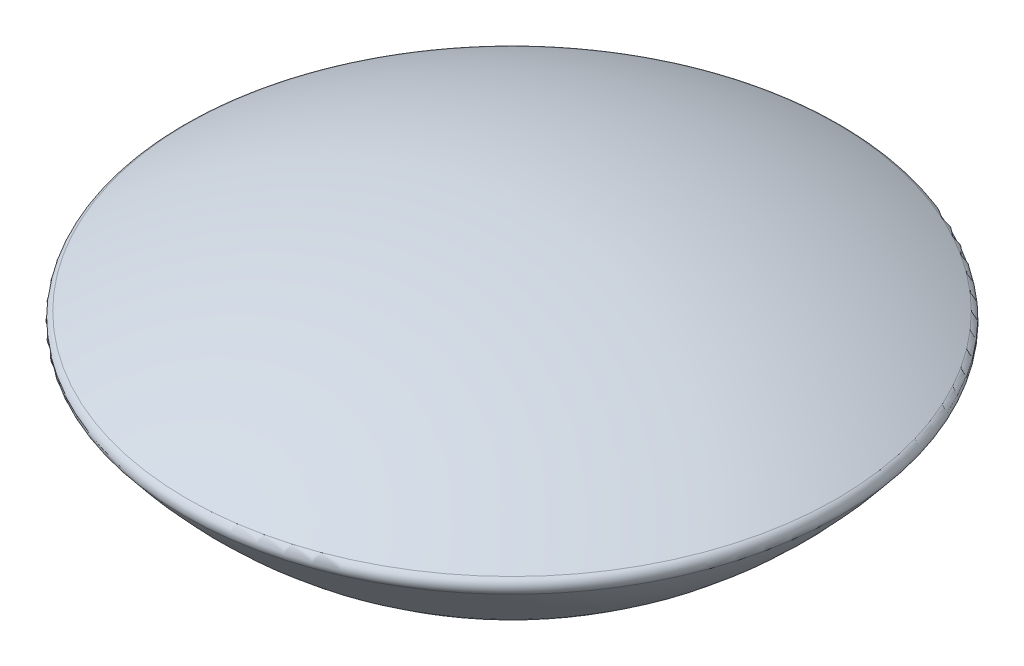
ISO-10303-21;
HEADER;
FILE_DESCRIPTION(('STEP AP214'),'2;1');
FILE_NAME('part.step','',(''),(''),'','','');
FILE_SCHEMA(('AUTOMOTIVE_DESIGN { 1 0 10303 214 1 1 1 1 }'));
ENDSEC;
DATA;
#1=APPLICATION_CONTEXT('core data for automotive mechanical design processes');
#2=APPLICATION_PROTOCOL_DEFINITION('international standard','automotive_design',2000,#1);
#3=PRODUCT_CONTEXT('',#1,'mechanical');
#4=PRODUCT('Part','Part','',(#3));
#5=PRODUCT_RELATED_PRODUCT_CATEGORY('part','',(#4));
#6=PRODUCT_DEFINITION_FORMATION('','',#4);
#7=PRODUCT_DEFINITION_CONTEXT('part definition',#1,'design');
#8=PRODUCT_DEFINITION('design','',#6,#7);
#9=PRODUCT_DEFINITION_SHAPE('','',#8);
#10=(LENGTH_UNIT() NAMED_UNIT(*) SI_UNIT(.MILLI.,.METRE.));
#11=(NAMED_UNIT(*) PLANE_ANGLE_UNIT() SI_UNIT($,.RADIAN.));
#12=(NAMED_UNIT(*) SI_UNIT($,.STERADIAN.) SOLID_ANGLE_UNIT());
#13=UNCERTAINTY_MEASURE_WITH_UNIT(LENGTH_MEASURE(1.E-05),#10,'distance_accuracy_value','');
#14=(GEOMETRIC_REPRESENTATION_CONTEXT(3) GLOBAL_UNCERTAINTY_ASSIGNED_CONTEXT((#13)) GLOBAL_UNIT_ASSIGNED_CONTEXT((#10,
#11,#12)) REPRESENTATION_CONTEXT('',''));
#15=CARTESIAN_POINT('',(0.,0.,0.));
#16=DIRECTION('',(0.,0.,1.));
#17=DIRECTION('',(1.,0.,0.));
#18=AXIS2_PLACEMENT_3D('',#15,#16,#17);
#19=CARTESIAN_POINT('',(0.,6.38,0.));
#20=DIRECTION('',(0.,1.,0.));
#21=DIRECTION('',(1.,0.,0.));
#22=AXIS2_PLACEMENT_3D('',#19,#20,#21);
#23=SPHERICAL_SURFACE('',#22,6.);
#24=CARTESIAN_POINT('',(0.,2.70993314369953,0.));
#25=DIRECTION('',(0.,1.,0.));
#26=DIRECTION('',(0.,0.,1.));
#27=AXIS2_PLACEMENT_3D('',#24,#25,#26);
#28=CIRCLE('',#27,4.74664189404308);
#29=CARTESIAN_POINT('',(0.,2.70993314369953,4.74664189404308));
#30=VERTEX_POINT('',#29);
#31=EDGE_CURVE('E10',#30,#30,#28,.T.);
#32=ORIENTED_EDGE('',*,*,#31,.F.);
#33=EDGE_LOOP('',(#32));
#34=FACE_BOUND('',#33,.T.);
#35=ADVANCED_FACE('F35',(#34),#23,.T.);
#36=CARTESIAN_POINT('',(0.,2.78938488284875,0.));
#37=DIRECTION('',(0.,1.,0.));
#38=DIRECTION('',(0.,0.,1.));
#39=AXIS2_PLACEMENT_3D('',#36,#37,#38);
#40=TOROIDAL_SURFACE('',#39,4.64388383312306,0.129891485240088);
#41=CARTESIAN_POINT('',(0.,2.90400114428793,0.));
#42=DIRECTION('',(0.,1.,0.));
#43=DIRECTION('',(0.,0.,1.));
#44=AXIS2_PLACEMENT_3D('',#41,#42,#43);
#45=CIRCLE('',#44,4.70499774767271);
#46=CARTESIAN_POINT('',(0.,2.90400114428793,4.70499774767271));
#47=VERTEX_POINT('',#46);
#48=EDGE_CURVE('E41',#47,#47,#45,.T.);
#49=ORIENTED_EDGE('',*,*,#48,.F.);
#50=EDGE_LOOP('',(#49));
#51=FACE_BOUND('',#50,.T.);
#52=ORIENTED_EDGE('',*,*,#31,.T.);
#53=EDGE_LOOP('',(#52));
#54=FACE_BOUND('',#53,.T.);
#55=ADVANCED_FACE('F49',(#51,#54),#40,.T.);
#56=CARTESIAN_POINT('',(0.,-5.92,0.));
#57=DIRECTION('',(0.,1.,0.));
#58=DIRECTION('',(1.,0.,0.));
#59=AXIS2_PLACEMENT_3D('',#56,#57,#58);
#60=SPHERICAL_SURFACE('',#59,10.);
#61=ORIENTED_EDGE('',*,*,#48,.T.);
#62=EDGE_LOOP('',(#61));
#63=FACE_BOUND('',#62,.T.);
#64=ADVANCED_FACE('F47',(#63),#60,.T.);
#65=CLOSED_SHELL('',(#35,#55,#64));
#66=MANIFOLD_SOLID_BREP('B2',#65);
#67=ADVANCED_BREP_SHAPE_REPRESENTATION('',(#18,#66),#14);
#68=SHAPE_DEFINITION_REPRESENTATION(#9,#67);
ENDSEC;
END-ISO-10303-21;
